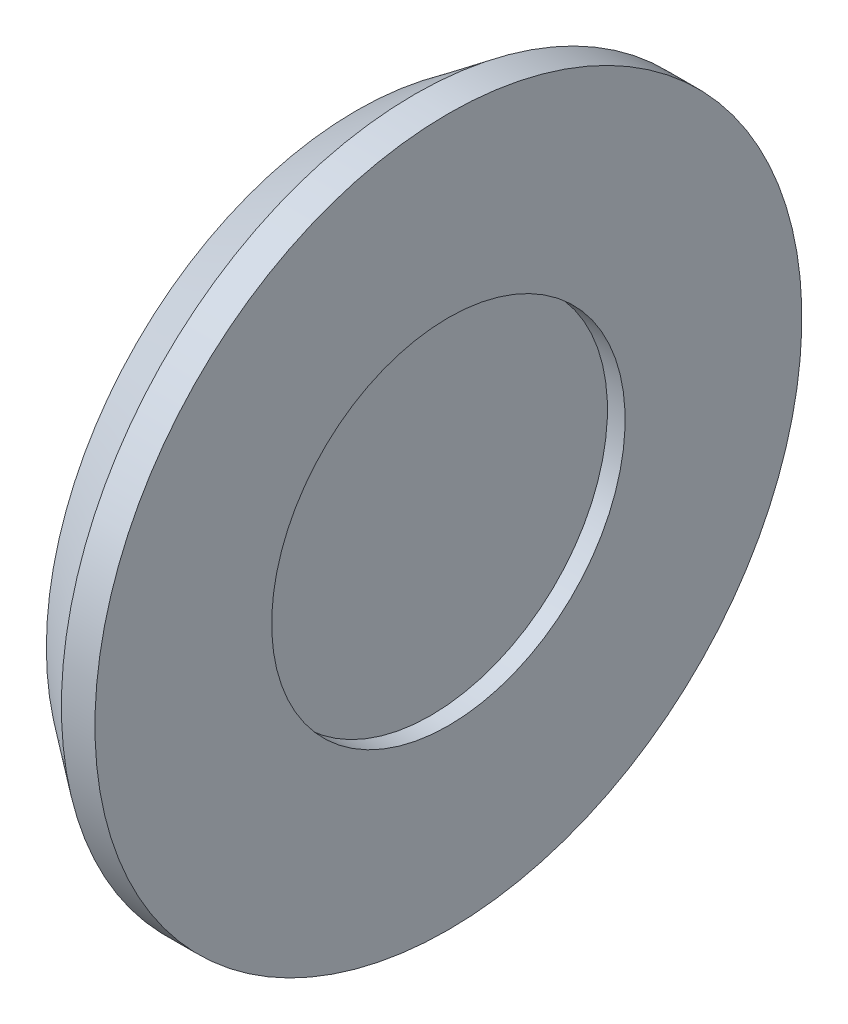
ISO-10303-21;
HEADER;
FILE_DESCRIPTION(('STEP AP214'),'2;1');
FILE_NAME('part.step','',(''),(''),'','','');
FILE_SCHEMA(('AUTOMOTIVE_DESIGN { 1 0 10303 214 1 1 1 1 }'));
ENDSEC;
DATA;
#1=APPLICATION_CONTEXT('core data for automotive mechanical design processes');
#2=APPLICATION_PROTOCOL_DEFINITION('international standard','automotive_design',2000,#1);
#3=PRODUCT_CONTEXT('',#1,'mechanical');
#4=PRODUCT('Part','Part','',(#3));
#5=PRODUCT_RELATED_PRODUCT_CATEGORY('part','',(#4));
#6=PRODUCT_DEFINITION_FORMATION('','',#4);
#7=PRODUCT_DEFINITION_CONTEXT('part definition',#1,'design');
#8=PRODUCT_DEFINITION('design','',#6,#7);
#9=PRODUCT_DEFINITION_SHAPE('','',#8);
#10=(LENGTH_UNIT() NAMED_UNIT(*) SI_UNIT(.MILLI.,.METRE.));
#11=(NAMED_UNIT(*) PLANE_ANGLE_UNIT() SI_UNIT($,.RADIAN.));
#12=(NAMED_UNIT(*) SI_UNIT($,.STERADIAN.) SOLID_ANGLE_UNIT());
#13=UNCERTAINTY_MEASURE_WITH_UNIT(LENGTH_MEASURE(1.E-05),#10,'distance_accuracy_value','');
#14=(GEOMETRIC_REPRESENTATION_CONTEXT(3) GLOBAL_UNCERTAINTY_ASSIGNED_CONTEXT((#13)) GLOBAL_UNIT_ASSIGNED_CONTEXT((#10,
#11,#12)) REPRESENTATION_CONTEXT('',''));
#15=CARTESIAN_POINT('',(0.,0.,0.));
#16=DIRECTION('',(0.,0.,1.));
#17=DIRECTION('',(1.,0.,0.));
#18=AXIS2_PLACEMENT_3D('',#15,#16,#17);
#19=CARTESIAN_POINT('',(3312.99999999996,4.08759507195785E-13,3349.99999999995));
#20=DIRECTION('',(-1.,0.,0.));
#21=DIRECTION('',(0.,-1.,0.));
#22=AXIS2_PLACEMENT_3D('',#19,#20,#21);
#23=CYLINDRICAL_SURFACE('',#22,200.);
#24=CARTESIAN_POINT('',(3424.99999999996,4.42089809583187E-13,3349.99999999995));
#25=DIRECTION('',(-1.,0.,0.));
#26=DIRECTION('',(0.,-1.,0.));
#27=AXIS2_PLACEMENT_3D('',#24,#25,#26);
#28=CIRCLE('',#27,200.);
#29=CARTESIAN_POINT('',(3424.99999999996,-200.,3349.99999999995));
#30=VERTEX_POINT('',#29);
#31=EDGE_CURVE('E22',#30,#30,#28,.T.);
#32=ORIENTED_EDGE('',*,*,#31,.T.);
#33=EDGE_LOOP('',(#32));
#34=FACE_BOUND('',#33,.T.);
#35=CARTESIAN_POINT('',(3405.99999999996,4.36435561856752E-13,3349.99999999995));
#36=DIRECTION('',(-1.,0.,0.));
#37=DIRECTION('',(0.,-1.,0.));
#38=AXIS2_PLACEMENT_3D('',#35,#36,#37);
#39=CIRCLE('',#38,200.);
#40=CARTESIAN_POINT('',(3405.99999999996,-200.,3349.99999999995));
#41=VERTEX_POINT('',#40);
#42=EDGE_CURVE('E41',#41,#41,#39,.T.);
#43=ORIENTED_EDGE('',*,*,#42,.F.);
#44=EDGE_LOOP('',(#43));
#45=FACE_BOUND('',#44,.T.);
#46=ADVANCED_FACE('F15',(#34,#45),#23,.T.);
#47=CARTESIAN_POINT('',(3424.99999999996,-200.,3349.99999999996));
#48=DIRECTION('',(1.,0.,0.));
#49=DIRECTION('',(0.,1.,0.));
#50=AXIS2_PLACEMENT_3D('',#47,#48,#49);
#51=PLANE('',#50);
#52=CARTESIAN_POINT('',(3424.99999999996,4.42089809583187E-13,3349.99999999995));
#53=DIRECTION('',(-1.,0.,0.));
#54=DIRECTION('',(0.,-1.,0.));
#55=AXIS2_PLACEMENT_3D('',#52,#53,#54);
#56=CIRCLE('',#55,100.);
#57=CARTESIAN_POINT('',(3424.99999999996,-99.9999999999996,3349.99999999995));
#58=VERTEX_POINT('',#57);
#59=EDGE_CURVE('E26',#58,#58,#56,.T.);
#60=ORIENTED_EDGE('',*,*,#59,.T.);
#61=EDGE_LOOP('',(#60));
#62=FACE_BOUND('',#61,.T.);
#63=ORIENTED_EDGE('',*,*,#31,.F.);
#64=EDGE_LOOP('',(#63));
#65=FACE_BOUND('',#64,.T.);
#66=ADVANCED_FACE('F49',(#62,#65),#51,.T.);
#67=CARTESIAN_POINT('',(3312.99999999996,4.08759507195785E-13,3349.99999999995));
#68=DIRECTION('',(-1.,0.,0.));
#69=DIRECTION('',(0.,-1.,0.));
#70=AXIS2_PLACEMENT_3D('',#67,#68,#69);
#71=CYLINDRICAL_SURFACE('',#70,100.);
#72=CARTESIAN_POINT('',(3414.99999999996,4.39113889727169E-13,3349.99999999995));
#73=DIRECTION('',(-1.,0.,0.));
#74=DIRECTION('',(0.,-1.,0.));
#75=AXIS2_PLACEMENT_3D('',#72,#73,#74);
#76=CIRCLE('',#75,100.);
#77=CARTESIAN_POINT('',(3414.99999999996,-99.9999999999996,3349.99999999995));
#78=VERTEX_POINT('',#77);
#79=EDGE_CURVE('E30',#78,#78,#76,.T.);
#80=ORIENTED_EDGE('',*,*,#79,.T.);
#81=EDGE_LOOP('',(#80));
#82=FACE_BOUND('',#81,.T.);
#83=ORIENTED_EDGE('',*,*,#59,.F.);
#84=EDGE_LOOP('',(#83));
#85=FACE_BOUND('',#84,.T.);
#86=ADVANCED_FACE('F55',(#82,#85),#71,.F.);
#87=CARTESIAN_POINT('',(3414.99999999996,-100.,3349.99999999995));
#88=DIRECTION('',(1.,0.,0.));
#89=DIRECTION('',(0.,1.,0.));
#90=AXIS2_PLACEMENT_3D('',#87,#88,#89);
#91=PLANE('',#90);
#92=ORIENTED_EDGE('',*,*,#79,.F.);
#93=EDGE_LOOP('',(#92));
#94=FACE_BOUND('',#93,.T.);
#95=ADVANCED_FACE('F69',(#94),#91,.T.);
#96=CARTESIAN_POINT('',(3372.99999999996,4.26615026331893E-13,3349.99999999995));
#97=DIRECTION('',(1.,0.,0.));
#98=DIRECTION('',(0.,1.,0.));
#99=AXIS2_PLACEMENT_3D('',#96,#97,#98);
#100=CONICAL_SURFACE('',#99,175.5,0.638634967153985);
#101=ORIENTED_EDGE('',*,*,#42,.T.);
#102=EDGE_LOOP('',(#101));
#103=FACE_BOUND('',#102,.T.);
#104=CARTESIAN_POINT('',(3372.99999999996,4.26615026331893E-13,3349.99999999995));
#105=DIRECTION('',(-1.,0.,0.));
#106=DIRECTION('',(0.,-1.,0.));
#107=AXIS2_PLACEMENT_3D('',#104,#105,#106);
#108=CIRCLE('',#107,175.5);
#109=CARTESIAN_POINT('',(3372.99999999996,-175.5,3349.99999999995));
#110=VERTEX_POINT('',#109);
#111=EDGE_CURVE('E38',#110,#110,#108,.T.);
#112=ORIENTED_EDGE('',*,*,#111,.F.);
#113=EDGE_LOOP('',(#112));
#114=FACE_BOUND('',#113,.T.);
#115=ADVANCED_FACE('F45',(#103,#114),#100,.T.);
#116=CARTESIAN_POINT('',(3394.49999999996,-157.5,3349.99999999996));
#117=DIRECTION('',(-1.,0.,0.));
#118=DIRECTION('',(0.,-1.,0.));
#119=AXIS2_PLACEMENT_3D('',#116,#117,#118);
#120=PLANE('',#119);
#121=CARTESIAN_POINT('',(3394.49999999996,4.33013254022332E-13,3349.99999999995));
#122=DIRECTION('',(-1.,0.,0.));
#123=DIRECTION('',(0.,-1.,0.));
#124=AXIS2_PLACEMENT_3D('',#121,#122,#123);
#125=CIRCLE('',#124,157.5);
#126=CARTESIAN_POINT('',(3394.49999999996,-157.5,3349.99999999995));
#127=VERTEX_POINT('',#126);
#128=EDGE_CURVE('E35',#127,#127,#125,.T.);
#129=ORIENTED_EDGE('',*,*,#128,.T.);
#130=EDGE_LOOP('',(#129));
#131=FACE_BOUND('',#130,.T.);
#132=ADVANCED_FACE('F65',(#131),#120,.T.);
#133=CARTESIAN_POINT('',(3312.99999999996,4.08759507195785E-13,3349.99999999995));
#134=DIRECTION('',(-1.,0.,0.));
#135=DIRECTION('',(0.,-1.,0.));
#136=AXIS2_PLACEMENT_3D('',#133,#134,#135);
#137=CYLINDRICAL_SURFACE('',#136,157.5);
#138=CARTESIAN_POINT('',(3372.99999999996,4.26615026331893E-13,3349.99999999995));
#139=DIRECTION('',(-1.,0.,0.));
#140=DIRECTION('',(0.,-1.,0.));
#141=AXIS2_PLACEMENT_3D('',#138,#139,#140);
#142=CIRCLE('',#141,157.5);
#143=CARTESIAN_POINT('',(3372.99999999996,-157.5,3349.99999999995));
#144=VERTEX_POINT('',#143);
#145=EDGE_CURVE('E10',#144,#144,#142,.T.);
#146=ORIENTED_EDGE('',*,*,#145,.T.);
#147=EDGE_LOOP('',(#146));
#148=FACE_BOUND('',#147,.T.);
#149=ORIENTED_EDGE('',*,*,#128,.F.);
#150=EDGE_LOOP('',(#149));
#151=FACE_BOUND('',#150,.T.);
#152=ADVANCED_FACE('F17',(#148,#151),#137,.F.);
#153=CARTESIAN_POINT('',(3372.99999999996,-157.5,3349.99999999996));
#154=DIRECTION('',(-1.,0.,0.));
#155=DIRECTION('',(0.,-1.,0.));
#156=AXIS2_PLACEMENT_3D('',#153,#154,#155);
#157=PLANE('',#156);
#158=ORIENTED_EDGE('',*,*,#145,.F.);
#159=EDGE_LOOP('',(#158));
#160=FACE_BOUND('',#159,.T.);
#161=ORIENTED_EDGE('',*,*,#111,.T.);
#162=EDGE_LOOP('',(#161));
#163=FACE_BOUND('',#162,.T.);
#164=ADVANCED_FACE('F59',(#160,#163),#157,.T.);
#165=CLOSED_SHELL('',(#46,#66,#86,#95,#115,#132,#152,#164));
#166=MANIFOLD_SOLID_BREP('B1',#165);
#167=ADVANCED_BREP_SHAPE_REPRESENTATION('',(#18,#166),#14);
#168=SHAPE_DEFINITION_REPRESENTATION(#9,#167);
ENDSEC;
END-ISO-10303-21;
